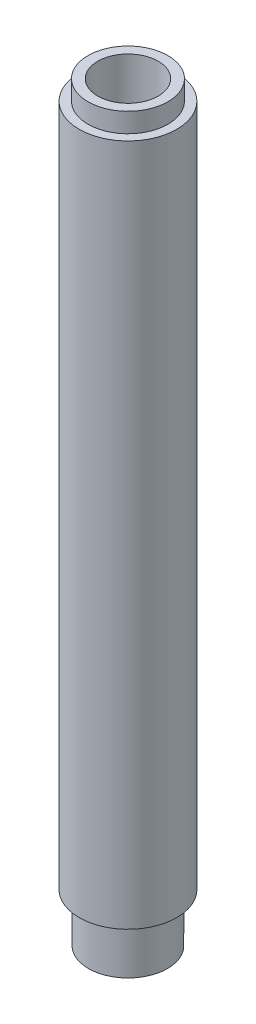
ISO-10303-21;
HEADER;
FILE_DESCRIPTION(('STEP AP214'),'2;1');
FILE_NAME('part.step','',(''),(''),'','','');
FILE_SCHEMA(('AUTOMOTIVE_DESIGN { 1 0 10303 214 1 1 1 1 }'));
ENDSEC;
DATA;
#1=APPLICATION_CONTEXT('core data for automotive mechanical design processes');
#2=APPLICATION_PROTOCOL_DEFINITION('international standard','automotive_design',2000,#1);
#3=PRODUCT_CONTEXT('',#1,'mechanical');
#4=PRODUCT('Part','Part','',(#3));
#5=PRODUCT_RELATED_PRODUCT_CATEGORY('part','',(#4));
#6=PRODUCT_DEFINITION_FORMATION('','',#4);
#7=PRODUCT_DEFINITION_CONTEXT('part definition',#1,'design');
#8=PRODUCT_DEFINITION('design','',#6,#7);
#9=PRODUCT_DEFINITION_SHAPE('','',#8);
#10=(LENGTH_UNIT() NAMED_UNIT(*) SI_UNIT(.MILLI.,.METRE.));
#11=(NAMED_UNIT(*) PLANE_ANGLE_UNIT() SI_UNIT($,.RADIAN.));
#12=(NAMED_UNIT(*) SI_UNIT($,.STERADIAN.) SOLID_ANGLE_UNIT());
#13=UNCERTAINTY_MEASURE_WITH_UNIT(LENGTH_MEASURE(1.E-05),#10,'distance_accuracy_value','');
#14=(GEOMETRIC_REPRESENTATION_CONTEXT(3) GLOBAL_UNCERTAINTY_ASSIGNED_CONTEXT((#13)) GLOBAL_UNIT_ASSIGNED_CONTEXT((#10,
#11,#12)) REPRESENTATION_CONTEXT('',''));
#15=CARTESIAN_POINT('',(0.,0.,0.));
#16=DIRECTION('',(0.,0.,1.));
#17=DIRECTION('',(1.,0.,0.));
#18=AXIS2_PLACEMENT_3D('',#15,#16,#17);
#19=CARTESIAN_POINT('',(0.,0.,0.));
#20=DIRECTION('',(0.,1.,0.));
#21=DIRECTION('',(0.,0.,1.));
#22=AXIS2_PLACEMENT_3D('',#19,#20,#21);
#23=PLANE('',#22);
#24=CARTESIAN_POINT('',(0.,0.,0.));
#25=DIRECTION('',(0.,1.,0.));
#26=DIRECTION('',(0.,0.,1.));
#27=AXIS2_PLACEMENT_3D('',#24,#25,#26);
#28=CIRCLE('',#27,12.7);
#29=CARTESIAN_POINT('',(0.,0.,12.7));
#30=VERTEX_POINT('',#29);
#31=EDGE_CURVE('E53',#30,#30,#28,.T.);
#32=ORIENTED_EDGE('',*,*,#31,.F.);
#33=EDGE_LOOP('',(#32));
#34=FACE_BOUND('',#33,.T.);
#35=CARTESIAN_POINT('',(0.,0.,0.));
#36=DIRECTION('',(0.,1.,0.));
#37=DIRECTION('',(0.,0.,1.));
#38=AXIS2_PLACEMENT_3D('',#35,#36,#37);
#39=CIRCLE('',#38,10.287);
#40=CARTESIAN_POINT('',(0.,0.,10.287));
#41=VERTEX_POINT('',#40);
#42=EDGE_CURVE('E10',#41,#41,#39,.F.);
#43=ORIENTED_EDGE('',*,*,#42,.F.);
#44=EDGE_LOOP('',(#43));
#45=FACE_BOUND('',#44,.T.);
#46=ADVANCED_FACE('F37',(#34,#45),#23,.F.);
#47=CARTESIAN_POINT('',(0.,177.8,0.));
#48=DIRECTION('',(0.,-1.,0.));
#49=DIRECTION('',(0.,0.,-1.));
#50=AXIS2_PLACEMENT_3D('',#47,#48,#49);
#51=CYLINDRICAL_SURFACE('',#50,12.7);
#52=CARTESIAN_POINT('',(0.,177.8,0.));
#53=DIRECTION('',(0.,1.,0.));
#54=DIRECTION('',(0.,0.,1.));
#55=AXIS2_PLACEMENT_3D('',#52,#53,#54);
#56=CIRCLE('',#55,12.7);
#57=CARTESIAN_POINT('',(0.,177.8,12.7));
#58=VERTEX_POINT('',#57);
#59=EDGE_CURVE('E48',#58,#58,#56,.T.);
#60=ORIENTED_EDGE('',*,*,#59,.F.);
#61=EDGE_LOOP('',(#60));
#62=FACE_BOUND('',#61,.T.);
#63=ORIENTED_EDGE('',*,*,#31,.T.);
#64=EDGE_LOOP('',(#63));
#65=FACE_BOUND('',#64,.T.);
#66=ADVANCED_FACE('F39',(#62,#65),#51,.T.);
#67=CARTESIAN_POINT('',(0.,177.8,0.));
#68=DIRECTION('',(0.,1.,0.));
#69=DIRECTION('',(0.,0.,1.));
#70=AXIS2_PLACEMENT_3D('',#67,#68,#69);
#71=PLANE('',#70);
#72=CARTESIAN_POINT('',(0.,177.8,0.));
#73=DIRECTION('',(0.,1.,0.));
#74=DIRECTION('',(0.,0.,1.));
#75=AXIS2_PLACEMENT_3D('',#72,#73,#74);
#76=CIRCLE('',#75,10.414);
#77=CARTESIAN_POINT('',(0.,177.8,10.414));
#78=VERTEX_POINT('',#77);
#79=EDGE_CURVE('E44',#78,#78,#76,.T.);
#80=ORIENTED_EDGE('',*,*,#79,.F.);
#81=EDGE_LOOP('',(#80));
#82=FACE_BOUND('',#81,.T.);
#83=ORIENTED_EDGE('',*,*,#59,.T.);
#84=EDGE_LOOP('',(#83));
#85=FACE_BOUND('',#84,.T.);
#86=ADVANCED_FACE('F97',(#82,#85),#71,.T.);
#87=CARTESIAN_POINT('',(0.,182.88,0.));
#88=DIRECTION('',(0.,-1.,0.));
#89=DIRECTION('',(0.,0.,-1.));
#90=AXIS2_PLACEMENT_3D('',#87,#88,#89);
#91=CYLINDRICAL_SURFACE('',#90,10.414);
#92=CARTESIAN_POINT('',(0.,182.88,0.));
#93=DIRECTION('',(0.,1.,0.));
#94=DIRECTION('',(0.,0.,1.));
#95=AXIS2_PLACEMENT_3D('',#92,#93,#94);
#96=CIRCLE('',#95,10.414);
#97=CARTESIAN_POINT('',(0.,182.88,10.414));
#98=VERTEX_POINT('',#97);
#99=EDGE_CURVE('E56',#98,#98,#96,.T.);
#100=ORIENTED_EDGE('',*,*,#99,.F.);
#101=EDGE_LOOP('',(#100));
#102=FACE_BOUND('',#101,.T.);
#103=ORIENTED_EDGE('',*,*,#79,.T.);
#104=EDGE_LOOP('',(#103));
#105=FACE_BOUND('',#104,.T.);
#106=ADVANCED_FACE('F103',(#102,#105),#91,.T.);
#107=CARTESIAN_POINT('',(0.,182.88,0.));
#108=DIRECTION('',(0.,1.,0.));
#109=DIRECTION('',(0.,0.,1.));
#110=AXIS2_PLACEMENT_3D('',#107,#108,#109);
#111=PLANE('',#110);
#112=CARTESIAN_POINT('',(0.,182.88,0.));
#113=DIRECTION('',(0.,1.,0.));
#114=DIRECTION('',(0.,0.,1.));
#115=AXIS2_PLACEMENT_3D('',#112,#113,#114);
#116=CIRCLE('',#115,7.874);
#117=CARTESIAN_POINT('',(0.,182.88,7.874));
#118=VERTEX_POINT('',#117);
#119=EDGE_CURVE('E62',#118,#118,#116,.T.);
#120=ORIENTED_EDGE('',*,*,#119,.F.);
#121=EDGE_LOOP('',(#120));
#122=FACE_BOUND('',#121,.T.);
#123=ORIENTED_EDGE('',*,*,#99,.T.);
#124=EDGE_LOOP('',(#123));
#125=FACE_BOUND('',#124,.T.);
#126=ADVANCED_FACE('F89',(#122,#125),#111,.T.);
#127=CARTESIAN_POINT('',(0.,0.,0.));
#128=DIRECTION('',(0.,1.,0.));
#129=DIRECTION('',(0.,0.,1.));
#130=AXIS2_PLACEMENT_3D('',#127,#128,#129);
#131=CYLINDRICAL_SURFACE('',#130,7.874);
#132=ORIENTED_EDGE('',*,*,#119,.T.);
#133=EDGE_LOOP('',(#132));
#134=FACE_BOUND('',#133,.T.);
#135=CARTESIAN_POINT('',(0.,-12.7,0.));
#136=DIRECTION('',(0.,-1.,0.));
#137=DIRECTION('',(0.,0.,-1.));
#138=AXIS2_PLACEMENT_3D('',#135,#136,#137);
#139=CIRCLE('',#138,7.874);
#140=CARTESIAN_POINT('',(0.,-12.7,-7.874));
#141=VERTEX_POINT('',#140);
#142=EDGE_CURVE('E70',#141,#141,#139,.T.);
#143=ORIENTED_EDGE('',*,*,#142,.T.);
#144=EDGE_LOOP('',(#143));
#145=FACE_BOUND('',#144,.T.);
#146=ADVANCED_FACE('F76',(#134,#145),#131,.F.);
#147=CARTESIAN_POINT('',(0.,-12.7,0.));
#148=DIRECTION('',(0.,-1.,0.));
#149=DIRECTION('',(0.,0.,-1.));
#150=AXIS2_PLACEMENT_3D('',#147,#148,#149);
#151=PLANE('',#150);
#152=CARTESIAN_POINT('',(0.,-12.7,0.));
#153=DIRECTION('',(0.,-1.,0.));
#154=DIRECTION('',(0.,0.,-1.));
#155=AXIS2_PLACEMENT_3D('',#152,#153,#154);
#156=CIRCLE('',#155,10.287);
#157=CARTESIAN_POINT('',(0.,-12.7,-10.287));
#158=VERTEX_POINT('',#157);
#159=EDGE_CURVE('E66',#158,#158,#156,.T.);
#160=ORIENTED_EDGE('',*,*,#159,.T.);
#161=EDGE_LOOP('',(#160));
#162=FACE_BOUND('',#161,.T.);
#163=ORIENTED_EDGE('',*,*,#142,.F.);
#164=EDGE_LOOP('',(#163));
#165=FACE_BOUND('',#164,.T.);
#166=ADVANCED_FACE('F78',(#162,#165),#151,.T.);
#167=CARTESIAN_POINT('',(0.,-12.7,0.));
#168=DIRECTION('',(0.,1.,0.));
#169=DIRECTION('',(0.,0.,1.));
#170=AXIS2_PLACEMENT_3D('',#167,#168,#169);
#171=CYLINDRICAL_SURFACE('',#170,10.287);
#172=ORIENTED_EDGE('',*,*,#159,.F.);
#173=EDGE_LOOP('',(#172));
#174=FACE_BOUND('',#173,.T.);
#175=ORIENTED_EDGE('',*,*,#42,.T.);
#176=EDGE_LOOP('',(#175));
#177=FACE_BOUND('',#176,.T.);
#178=ADVANCED_FACE('F80',(#174,#177),#171,.T.);
#179=CLOSED_SHELL('',(#46,#66,#86,#106,#126,#146,#166,#178));
#180=MANIFOLD_SOLID_BREP('B2',#179);
#181=ADVANCED_BREP_SHAPE_REPRESENTATION('',(#18,#180),#14);
#182=SHAPE_DEFINITION_REPRESENTATION(#9,#181);
ENDSEC;
END-ISO-10303-21;
